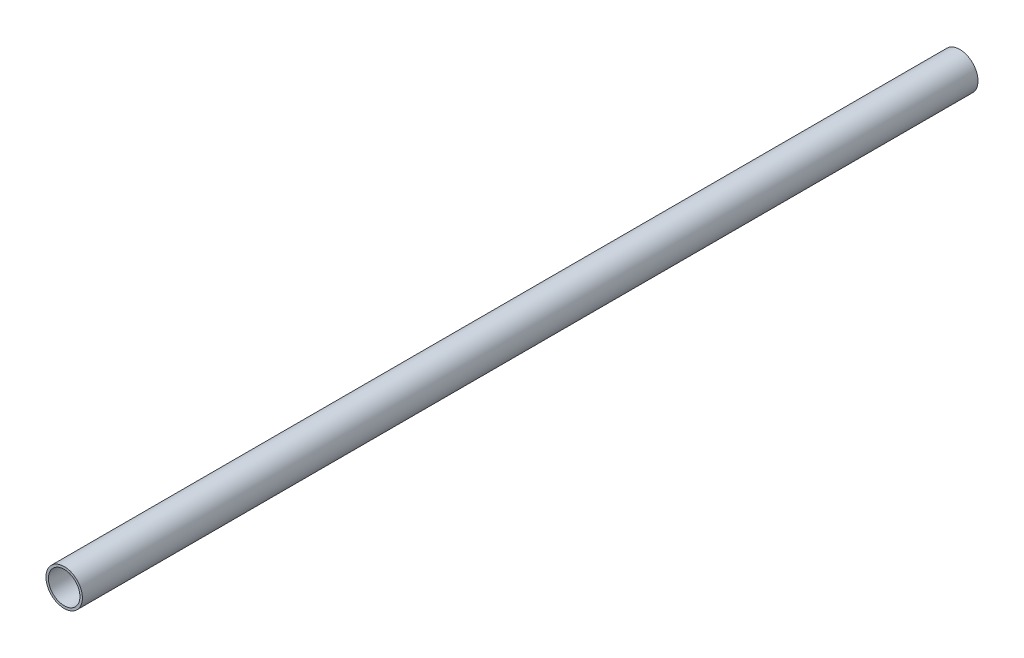
ISO-10303-21;
HEADER;
FILE_DESCRIPTION(('STEP AP214'),'2;1');
FILE_NAME('part.step','',(''),(''),'','','');
FILE_SCHEMA(('AUTOMOTIVE_DESIGN { 1 0 10303 214 1 1 1 1 }'));
ENDSEC;
DATA;
#1=APPLICATION_CONTEXT('core data for automotive mechanical design processes');
#2=APPLICATION_PROTOCOL_DEFINITION('international standard','automotive_design',2000,#1);
#3=PRODUCT_CONTEXT('',#1,'mechanical');
#4=PRODUCT('Part','Part','',(#3));
#5=PRODUCT_RELATED_PRODUCT_CATEGORY('part','',(#4));
#6=PRODUCT_DEFINITION_FORMATION('','',#4);
#7=PRODUCT_DEFINITION_CONTEXT('part definition',#1,'design');
#8=PRODUCT_DEFINITION('design','',#6,#7);
#9=PRODUCT_DEFINITION_SHAPE('','',#8);
#10=(LENGTH_UNIT() NAMED_UNIT(*) SI_UNIT(.MILLI.,.METRE.));
#11=(NAMED_UNIT(*) PLANE_ANGLE_UNIT() SI_UNIT($,.RADIAN.));
#12=(NAMED_UNIT(*) SI_UNIT($,.STERADIAN.) SOLID_ANGLE_UNIT());
#13=UNCERTAINTY_MEASURE_WITH_UNIT(LENGTH_MEASURE(1.E-05),#10,'distance_accuracy_value','');
#14=(GEOMETRIC_REPRESENTATION_CONTEXT(3) GLOBAL_UNCERTAINTY_ASSIGNED_CONTEXT((#13)) GLOBAL_UNIT_ASSIGNED_CONTEXT((#10,
#11,#12)) REPRESENTATION_CONTEXT('',''));
#15=CARTESIAN_POINT('',(0.,0.,0.));
#16=DIRECTION('',(0.,0.,1.));
#17=DIRECTION('',(1.,0.,0.));
#18=AXIS2_PLACEMENT_3D('',#15,#16,#17);
#19=CARTESIAN_POINT('',(0.,0.,312.3));
#20=DIRECTION('',(0.,0.,-1.));
#21=DIRECTION('',(-1.,0.,0.));
#22=AXIS2_PLACEMENT_3D('',#19,#20,#21);
#23=CYLINDRICAL_SURFACE('',#22,6.35);
#24=CARTESIAN_POINT('',(0.,0.,312.3));
#25=DIRECTION('',(0.,0.,1.));
#26=DIRECTION('',(1.,0.,0.));
#27=AXIS2_PLACEMENT_3D('',#24,#25,#26);
#28=CIRCLE('',#27,6.35);
#29=CARTESIAN_POINT('',(6.35,0.,312.3));
#30=VERTEX_POINT('',#29);
#31=EDGE_CURVE('E10',#30,#30,#28,.T.);
#32=ORIENTED_EDGE('',*,*,#31,.F.);
#33=EDGE_LOOP('',(#32));
#34=FACE_BOUND('',#33,.T.);
#35=CARTESIAN_POINT('',(0.,0.,0.));
#36=DIRECTION('',(0.,0.,1.));
#37=DIRECTION('',(1.,0.,0.));
#38=AXIS2_PLACEMENT_3D('',#35,#36,#37);
#39=CIRCLE('',#38,6.35);
#40=CARTESIAN_POINT('',(6.35,0.,0.));
#41=VERTEX_POINT('',#40);
#42=EDGE_CURVE('E51',#41,#41,#39,.T.);
#43=ORIENTED_EDGE('',*,*,#42,.T.);
#44=EDGE_LOOP('',(#43));
#45=FACE_BOUND('',#44,.T.);
#46=ADVANCED_FACE('F43',(#34,#45),#23,.T.);
#47=CARTESIAN_POINT('',(0.,0.,312.3));
#48=DIRECTION('',(0.,0.,1.));
#49=DIRECTION('',(1.,0.,0.));
#50=AXIS2_PLACEMENT_3D('',#47,#48,#49);
#51=PLANE('',#50);
#52=CARTESIAN_POINT('',(0.,0.,312.3));
#53=DIRECTION('',(0.,0.,1.));
#54=DIRECTION('',(1.,0.,0.));
#55=AXIS2_PLACEMENT_3D('',#52,#53,#54);
#56=CIRCLE('',#55,5.5);
#57=CARTESIAN_POINT('',(5.5,0.,312.3));
#58=VERTEX_POINT('',#57);
#59=EDGE_CURVE('E57',#58,#58,#56,.F.);
#60=ORIENTED_EDGE('',*,*,#59,.T.);
#61=EDGE_LOOP('',(#60));
#62=FACE_BOUND('',#61,.T.);
#63=ORIENTED_EDGE('',*,*,#31,.T.);
#64=EDGE_LOOP('',(#63));
#65=FACE_BOUND('',#64,.T.);
#66=ADVANCED_FACE('F72',(#62,#65),#51,.T.);
#67=CARTESIAN_POINT('',(0.,0.,0.));
#68=DIRECTION('',(0.,0.,1.));
#69=DIRECTION('',(1.,0.,0.));
#70=AXIS2_PLACEMENT_3D('',#67,#68,#69);
#71=PLANE('',#70);
#72=CARTESIAN_POINT('',(0.,0.,0.));
#73=DIRECTION('',(0.,0.,1.));
#74=DIRECTION('',(1.,0.,0.));
#75=AXIS2_PLACEMENT_3D('',#72,#73,#74);
#76=CIRCLE('',#75,5.5);
#77=CARTESIAN_POINT('',(5.5,0.,0.));
#78=VERTEX_POINT('',#77);
#79=EDGE_CURVE('E46',#78,#78,#76,.F.);
#80=ORIENTED_EDGE('',*,*,#79,.F.);
#81=EDGE_LOOP('',(#80));
#82=FACE_BOUND('',#81,.T.);
#83=ORIENTED_EDGE('',*,*,#42,.F.);
#84=EDGE_LOOP('',(#83));
#85=FACE_BOUND('',#84,.T.);
#86=ADVANCED_FACE('F69',(#82,#85),#71,.F.);
#87=CARTESIAN_POINT('',(0.,0.,414.3));
#88=DIRECTION('',(0.,0.,-1.));
#89=DIRECTION('',(-1.,0.,0.));
#90=AXIS2_PLACEMENT_3D('',#87,#88,#89);
#91=CYLINDRICAL_SURFACE('',#90,5.5);
#92=ORIENTED_EDGE('',*,*,#59,.F.);
#93=EDGE_LOOP('',(#92));
#94=FACE_BOUND('',#93,.T.);
#95=ORIENTED_EDGE('',*,*,#79,.T.);
#96=EDGE_LOOP('',(#95));
#97=FACE_BOUND('',#96,.T.);
#98=ADVANCED_FACE('F67',(#94,#97),#91,.F.);
#99=CLOSED_SHELL('',(#46,#66,#86,#98));
#100=MANIFOLD_SOLID_BREP('B2',#99);
#101=ADVANCED_BREP_SHAPE_REPRESENTATION('',(#18,#100),#14);
#102=SHAPE_DEFINITION_REPRESENTATION(#9,#101);
ENDSEC;
END-ISO-10303-21;
